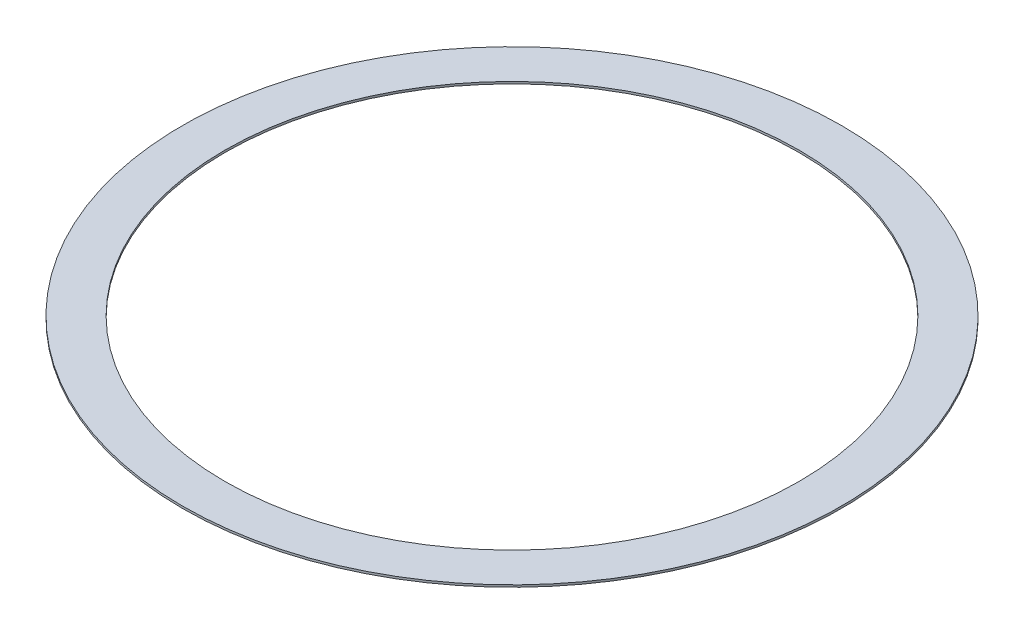
ISO-10303-21;
HEADER;
FILE_DESCRIPTION(('STEP AP214'),'2;1');
FILE_NAME('part.step','',(''),(''),'','','');
FILE_SCHEMA(('AUTOMOTIVE_DESIGN { 1 0 10303 214 1 1 1 1 }'));
ENDSEC;
DATA;
#1=APPLICATION_CONTEXT('core data for automotive mechanical design processes');
#2=APPLICATION_PROTOCOL_DEFINITION('international standard','automotive_design',2000,#1);
#3=PRODUCT_CONTEXT('',#1,'mechanical');
#4=PRODUCT('Part','Part','',(#3));
#5=PRODUCT_RELATED_PRODUCT_CATEGORY('part','',(#4));
#6=PRODUCT_DEFINITION_FORMATION('','',#4);
#7=PRODUCT_DEFINITION_CONTEXT('part definition',#1,'design');
#8=PRODUCT_DEFINITION('design','',#6,#7);
#9=PRODUCT_DEFINITION_SHAPE('','',#8);
#10=(LENGTH_UNIT() NAMED_UNIT(*) SI_UNIT(.MILLI.,.METRE.));
#11=(NAMED_UNIT(*) PLANE_ANGLE_UNIT() SI_UNIT($,.RADIAN.));
#12=(NAMED_UNIT(*) SI_UNIT($,.STERADIAN.) SOLID_ANGLE_UNIT());
#13=UNCERTAINTY_MEASURE_WITH_UNIT(LENGTH_MEASURE(1.E-05),#10,'distance_accuracy_value','');
#14=(GEOMETRIC_REPRESENTATION_CONTEXT(3) GLOBAL_UNCERTAINTY_ASSIGNED_CONTEXT((#13)) GLOBAL_UNIT_ASSIGNED_CONTEXT((#10,
#11,#12)) REPRESENTATION_CONTEXT('',''));
#15=CARTESIAN_POINT('',(0.,0.,0.));
#16=DIRECTION('',(0.,0.,1.));
#17=DIRECTION('',(1.,0.,0.));
#18=AXIS2_PLACEMENT_3D('',#15,#16,#17);
#19=CARTESIAN_POINT('',(0.,0.1,0.));
#20=DIRECTION('',(0.,1.,0.));
#21=DIRECTION('',(0.,0.,1.));
#22=AXIS2_PLACEMENT_3D('',#19,#20,#21);
#23=PLANE('',#22);
#24=CARTESIAN_POINT('',(0.,0.1,0.));
#25=DIRECTION('',(0.,1.,0.));
#26=DIRECTION('',(0.,0.,1.));
#27=AXIS2_PLACEMENT_3D('',#24,#25,#26);
#28=CIRCLE('',#27,15.5);
#29=CARTESIAN_POINT('',(0.,0.1,15.5));
#30=VERTEX_POINT('',#29);
#31=EDGE_CURVE('E10',#30,#30,#28,.T.);
#32=ORIENTED_EDGE('',*,*,#31,.T.);
#33=EDGE_LOOP('',(#32));
#34=FACE_BOUND('',#33,.T.);
#35=CARTESIAN_POINT('',(0.,0.1,0.));
#36=DIRECTION('',(0.,1.,0.));
#37=DIRECTION('',(0.,0.,1.));
#38=AXIS2_PLACEMENT_3D('',#35,#36,#37);
#39=CIRCLE('',#38,13.5);
#40=CARTESIAN_POINT('',(0.,0.1,13.5));
#41=VERTEX_POINT('',#40);
#42=EDGE_CURVE('E42',#41,#41,#39,.T.);
#43=ORIENTED_EDGE('',*,*,#42,.F.);
#44=EDGE_LOOP('',(#43));
#45=FACE_BOUND('',#44,.T.);
#46=ADVANCED_FACE('F31',(#34,#45),#23,.T.);
#47=CARTESIAN_POINT('',(0.,0.,0.));
#48=DIRECTION('',(0.,1.,0.));
#49=DIRECTION('',(0.,0.,1.));
#50=AXIS2_PLACEMENT_3D('',#47,#48,#49);
#51=PLANE('',#50);
#52=CARTESIAN_POINT('',(0.,0.,0.));
#53=DIRECTION('',(0.,1.,0.));
#54=DIRECTION('',(0.,0.,1.));
#55=AXIS2_PLACEMENT_3D('',#52,#53,#54);
#56=CIRCLE('',#55,15.5);
#57=CARTESIAN_POINT('',(0.,0.,15.5));
#58=VERTEX_POINT('',#57);
#59=EDGE_CURVE('E35',#58,#58,#56,.T.);
#60=ORIENTED_EDGE('',*,*,#59,.F.);
#61=EDGE_LOOP('',(#60));
#62=FACE_BOUND('',#61,.T.);
#63=CARTESIAN_POINT('',(0.,0.,0.));
#64=DIRECTION('',(0.,1.,0.));
#65=DIRECTION('',(0.,0.,1.));
#66=AXIS2_PLACEMENT_3D('',#63,#64,#65);
#67=CIRCLE('',#66,13.5);
#68=CARTESIAN_POINT('',(0.,0.,13.5));
#69=VERTEX_POINT('',#68);
#70=EDGE_CURVE('E44',#69,#69,#67,.T.);
#71=ORIENTED_EDGE('',*,*,#70,.T.);
#72=EDGE_LOOP('',(#71));
#73=FACE_BOUND('',#72,.T.);
#74=ADVANCED_FACE('F54',(#62,#73),#51,.F.);
#75=CARTESIAN_POINT('',(0.,0.1,0.));
#76=DIRECTION('',(0.,-1.,0.));
#77=DIRECTION('',(0.,0.,-1.));
#78=AXIS2_PLACEMENT_3D('',#75,#76,#77);
#79=CYLINDRICAL_SURFACE('',#78,15.5);
#80=ORIENTED_EDGE('',*,*,#31,.F.);
#81=EDGE_LOOP('',(#80));
#82=FACE_BOUND('',#81,.T.);
#83=ORIENTED_EDGE('',*,*,#59,.T.);
#84=EDGE_LOOP('',(#83));
#85=FACE_BOUND('',#84,.T.);
#86=ADVANCED_FACE('F33',(#82,#85),#79,.T.);
#87=CARTESIAN_POINT('',(0.,0.1,0.));
#88=DIRECTION('',(0.,-1.,0.));
#89=DIRECTION('',(0.,0.,-1.));
#90=AXIS2_PLACEMENT_3D('',#87,#88,#89);
#91=CYLINDRICAL_SURFACE('',#90,13.5);
#92=ORIENTED_EDGE('',*,*,#42,.T.);
#93=EDGE_LOOP('',(#92));
#94=FACE_BOUND('',#93,.T.);
#95=ORIENTED_EDGE('',*,*,#70,.F.);
#96=EDGE_LOOP('',(#95));
#97=FACE_BOUND('',#96,.T.);
#98=ADVANCED_FACE('F50',(#94,#97),#91,.F.);
#99=CLOSED_SHELL('',(#46,#74,#86,#98));
#100=MANIFOLD_SOLID_BREP('B2',#99);
#101=ADVANCED_BREP_SHAPE_REPRESENTATION('',(#18,#100),#14);
#102=SHAPE_DEFINITION_REPRESENTATION(#9,#101);
ENDSEC;
END-ISO-10303-21;
